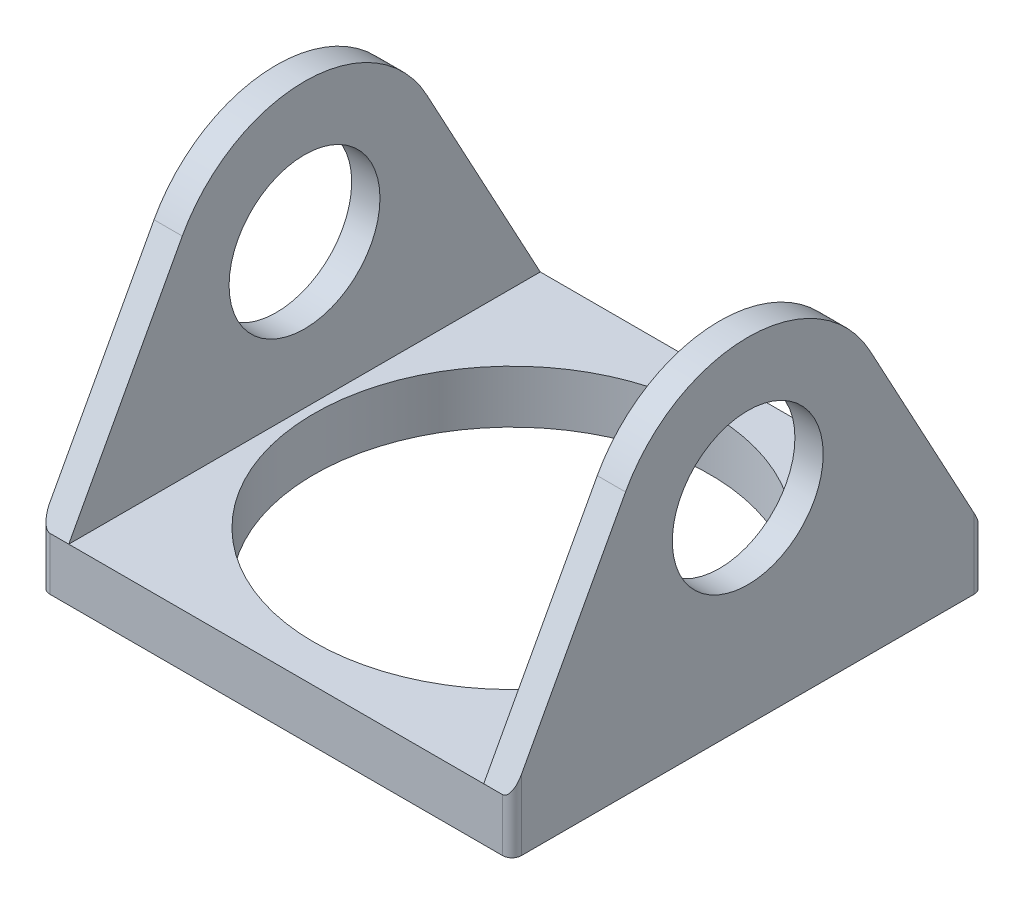
ISO-10303-21;
HEADER;
FILE_DESCRIPTION(('STEP AP214'),'2;1');
FILE_NAME('part.step','',(''),(''),'','','');
FILE_SCHEMA(('AUTOMOTIVE_DESIGN { 1 0 10303 214 1 1 1 1 }'));
ENDSEC;
DATA;
#1=APPLICATION_CONTEXT('core data for automotive mechanical design processes');
#2=APPLICATION_PROTOCOL_DEFINITION('international standard','automotive_design',2000,#1);
#3=PRODUCT_CONTEXT('',#1,'mechanical');
#4=PRODUCT('Part','Part','',(#3));
#5=PRODUCT_RELATED_PRODUCT_CATEGORY('part','',(#4));
#6=PRODUCT_DEFINITION_FORMATION('','',#4);
#7=PRODUCT_DEFINITION_CONTEXT('part definition',#1,'design');
#8=PRODUCT_DEFINITION('design','',#6,#7);
#9=PRODUCT_DEFINITION_SHAPE('','',#8);
#10=(LENGTH_UNIT() NAMED_UNIT(*) SI_UNIT(.MILLI.,.METRE.));
#11=(NAMED_UNIT(*) PLANE_ANGLE_UNIT() SI_UNIT($,.RADIAN.));
#12=(NAMED_UNIT(*) SI_UNIT($,.STERADIAN.) SOLID_ANGLE_UNIT());
#13=UNCERTAINTY_MEASURE_WITH_UNIT(LENGTH_MEASURE(1.E-05),#10,'distance_accuracy_value','');
#14=(GEOMETRIC_REPRESENTATION_CONTEXT(3) GLOBAL_UNCERTAINTY_ASSIGNED_CONTEXT((#13)) GLOBAL_UNIT_ASSIGNED_CONTEXT((#10,
#11,#12)) REPRESENTATION_CONTEXT('',''));
#15=CARTESIAN_POINT('',(0.,0.,0.));
#16=DIRECTION('',(0.,0.,1.));
#17=DIRECTION('',(1.,0.,0.));
#18=AXIS2_PLACEMENT_3D('',#15,#16,#17);
#19=CARTESIAN_POINT('',(125.,28.,-125.));
#20=DIRECTION('',(-1.,0.,0.));
#21=DIRECTION('',(0.,0.,1.));
#22=AXIS2_PLACEMENT_3D('',#19,#20,#21);
#23=PLANE('',#22);
#24=CARTESIAN_POINT('',(125.,104.34,0.));
#25=DIRECTION('',(1.,0.,0.));
#26=DIRECTION('',(0.,0.,-1.));
#27=AXIS2_PLACEMENT_3D('',#24,#25,#26);
#28=CIRCLE('',#27,40.);
#29=CARTESIAN_POINT('',(125.,104.34,-40.));
#30=VERTEX_POINT('',#29);
#31=EDGE_CURVE('E205',#30,#30,#28,.T.);
#32=ORIENTED_EDGE('',*,*,#31,.F.);
#33=EDGE_LOOP('',(#32));
#34=FACE_BOUND('',#33,.T.);
#35=DIRECTION('',(0.,-0.879697709797917,0.475533320994755));
#36=VECTOR('',#35,1.);
#37=CARTESIAN_POINT('',(125.,132.581393352921,68.4670151559249));
#38=LINE('',#37,#36);
#39=CARTESIAN_POINT('',(125.,139.367784424474,64.7985333037145));
#40=VERTEX_POINT('',#39);
#41=CARTESIAN_POINT('',(125.,37.2495906276104,120.));
#42=VERTEX_POINT('',#41);
#43=EDGE_CURVE('E201',#40,#42,#38,.T.);
#44=ORIENTED_EDGE('',*,*,#43,.T.);
#45=DIRECTION('',(0.,-1.,0.));
#46=VECTOR('',#45,1.);
#47=CARTESIAN_POINT('',(125.,28.,120.));
#48=LINE('',#47,#46);
#49=CARTESIAN_POINT('',(125.,0.,120.));
#50=VERTEX_POINT('',#49);
#51=EDGE_CURVE('E299',#42,#50,#48,.T.);
#52=ORIENTED_EDGE('',*,*,#51,.T.);
#53=DIRECTION('',(0.,0.,-1.));
#54=VECTOR('',#53,1.);
#55=CARTESIAN_POINT('',(125.,0.,-125.));
#56=LINE('',#55,#54);
#57=CARTESIAN_POINT('',(125.,0.,-120.));
#58=VERTEX_POINT('',#57);
#59=EDGE_CURVE('E233',#50,#58,#56,.T.);
#60=ORIENTED_EDGE('',*,*,#59,.T.);
#61=DIRECTION('',(0.,-1.,0.));
#62=VECTOR('',#61,1.);
#63=CARTESIAN_POINT('',(125.,28.,-120.));
#64=LINE('',#63,#62);
#65=CARTESIAN_POINT('',(125.,37.2495906276107,-120.));
#66=VERTEX_POINT('',#65);
#67=EDGE_CURVE('E296',#58,#66,#64,.F.);
#68=ORIENTED_EDGE('',*,*,#67,.T.);
#69=DIRECTION('',(0.,0.879697709797917,0.475533320994755));
#70=VECTOR('',#69,1.);
#71=CARTESIAN_POINT('',(125.,28.,-125.));
#72=LINE('',#71,#70);
#73=CARTESIAN_POINT('',(125.,139.367784424474,-64.7985333037146));
#74=VERTEX_POINT('',#73);
#75=EDGE_CURVE('E165',#66,#74,#72,.T.);
#76=ORIENTED_EDGE('',*,*,#75,.T.);
#77=CARTESIAN_POINT('',(125.,104.34,0.));
#78=DIRECTION('',(-1.,0.,0.));
#79=DIRECTION('',(0.,0.,1.));
#80=AXIS2_PLACEMENT_3D('',#77,#78,#79);
#81=CIRCLE('',#80,73.66);
#82=EDGE_CURVE('E186',#74,#40,#81,.F.);
#83=ORIENTED_EDGE('',*,*,#82,.T.);
#84=EDGE_LOOP('',(#44,#52,#60,#68,#76,#83));
#85=FACE_BOUND('',#84,.T.);
#86=ADVANCED_FACE('F38',(#34,#85),#23,.F.);
#87=CARTESIAN_POINT('',(-125.,28.,-125.));
#88=DIRECTION('',(0.,0.,1.));
#89=DIRECTION('',(1.,0.,0.));
#90=AXIS2_PLACEMENT_3D('',#87,#88,#89);
#91=PLANE('',#90);
#92=DIRECTION('',(-1.,0.,0.));
#93=VECTOR('',#92,1.);
#94=CARTESIAN_POINT('',(-125.,0.,-125.));
#95=LINE('',#94,#93);
#96=CARTESIAN_POINT('',(120.,0.,-125.));
#97=VERTEX_POINT('',#96);
#98=CARTESIAN_POINT('',(-120.,0.,-125.));
#99=VERTEX_POINT('',#98);
#100=EDGE_CURVE('E247',#97,#99,#95,.T.);
#101=ORIENTED_EDGE('',*,*,#100,.T.);
#102=DIRECTION('',(0.,-1.,0.));
#103=VECTOR('',#102,1.);
#104=CARTESIAN_POINT('',(-120.,28.,-125.));
#105=LINE('',#104,#103);
#106=CARTESIAN_POINT('',(-120.,28.,-125.));
#107=VERTEX_POINT('',#106);
#108=EDGE_CURVE('E60',#99,#107,#105,.F.);
#109=ORIENTED_EDGE('',*,*,#108,.T.);
#110=DIRECTION('',(-1.,0.,0.));
#111=VECTOR('',#110,1.);
#112=CARTESIAN_POINT('',(619.791622807016,28.,-125.));
#113=LINE('',#112,#111);
#114=CARTESIAN_POINT('',(-110.,28.,-125.));
#115=VERTEX_POINT('',#114);
#116=EDGE_CURVE('E316',#115,#107,#113,.T.);
#117=ORIENTED_EDGE('',*,*,#116,.F.);
#118=DIRECTION('',(-1.,0.,0.));
#119=VECTOR('',#118,1.);
#120=CARTESIAN_POINT('',(-125.,28.,-125.));
#121=LINE('',#120,#119);
#122=CARTESIAN_POINT('',(110.,28.,-125.));
#123=VERTEX_POINT('',#122);
#124=EDGE_CURVE('E234',#123,#115,#121,.T.);
#125=ORIENTED_EDGE('',*,*,#124,.F.);
#126=CARTESIAN_POINT('',(120.,28.,-125.));
#127=VERTEX_POINT('',#126);
#128=EDGE_CURVE('E330',#127,#123,#113,.T.);
#129=ORIENTED_EDGE('',*,*,#128,.F.);
#130=DIRECTION('',(0.,-1.,0.));
#131=VECTOR('',#130,1.);
#132=CARTESIAN_POINT('',(120.,28.,-125.));
#133=LINE('',#132,#131);
#134=EDGE_CURVE('E306',#127,#97,#133,.T.);
#135=ORIENTED_EDGE('',*,*,#134,.T.);
#136=EDGE_LOOP('',(#101,#109,#117,#125,#129,#135));
#137=FACE_BOUND('',#136,.T.);
#138=ADVANCED_FACE('F327',(#137),#91,.F.);
#139=CARTESIAN_POINT('',(-125.,28.,-125.));
#140=DIRECTION('',(1.,0.,0.));
#141=DIRECTION('',(0.,0.,-1.));
#142=AXIS2_PLACEMENT_3D('',#139,#140,#141);
#143=PLANE('',#142);
#144=CARTESIAN_POINT('',(-125.,104.34,0.));
#145=DIRECTION('',(1.,0.,0.));
#146=DIRECTION('',(0.,0.,-1.));
#147=AXIS2_PLACEMENT_3D('',#144,#145,#146);
#148=CIRCLE('',#147,40.);
#149=CARTESIAN_POINT('',(-125.,104.34,-40.));
#150=VERTEX_POINT('',#149);
#151=EDGE_CURVE('E206',#150,#150,#148,.T.);
#152=ORIENTED_EDGE('',*,*,#151,.T.);
#153=EDGE_LOOP('',(#152));
#154=FACE_BOUND('',#153,.T.);
#155=DIRECTION('',(0.,0.,1.));
#156=VECTOR('',#155,1.);
#157=CARTESIAN_POINT('',(-125.,0.,-125.));
#158=LINE('',#157,#156);
#159=CARTESIAN_POINT('',(-125.,0.,-120.));
#160=VERTEX_POINT('',#159);
#161=CARTESIAN_POINT('',(-125.,0.,120.));
#162=VERTEX_POINT('',#161);
#163=EDGE_CURVE('E250',#160,#162,#158,.T.);
#164=ORIENTED_EDGE('',*,*,#163,.T.);
#165=DIRECTION('',(0.,-1.,0.));
#166=VECTOR('',#165,1.);
#167=CARTESIAN_POINT('',(-125.,28.,120.));
#168=LINE('',#167,#166);
#169=CARTESIAN_POINT('',(-125.,37.2495906276105,120.));
#170=VERTEX_POINT('',#169);
#171=EDGE_CURVE('E290',#162,#170,#168,.F.);
#172=ORIENTED_EDGE('',*,*,#171,.T.);
#173=DIRECTION('',(0.,0.879697709797917,-0.475533320994755));
#174=VECTOR('',#173,1.);
#175=CARTESIAN_POINT('',(-125.,132.581393352921,68.467015155925));
#176=LINE('',#175,#174);
#177=CARTESIAN_POINT('',(-125.,139.367784424474,64.7985333037146));
#178=VERTEX_POINT('',#177);
#179=EDGE_CURVE('E164',#170,#178,#176,.T.);
#180=ORIENTED_EDGE('',*,*,#179,.T.);
#181=CARTESIAN_POINT('',(-125.,104.34,0.));
#182=DIRECTION('',(1.,0.,0.));
#183=DIRECTION('',(0.,0.,-1.));
#184=AXIS2_PLACEMENT_3D('',#181,#182,#183);
#185=CIRCLE('',#184,73.66);
#186=CARTESIAN_POINT('',(-125.,139.367784424474,-64.7985333037145));
#187=VERTEX_POINT('',#186);
#188=EDGE_CURVE('E153',#178,#187,#185,.F.);
#189=ORIENTED_EDGE('',*,*,#188,.T.);
#190=DIRECTION('',(0.,-0.879697709797917,-0.475533320994755));
#191=VECTOR('',#190,1.);
#192=CARTESIAN_POINT('',(-125.,28.,-125.));
#193=LINE('',#192,#191);
#194=CARTESIAN_POINT('',(-125.,37.2495906276105,-120.));
#195=VERTEX_POINT('',#194);
#196=EDGE_CURVE('E193',#187,#195,#193,.T.);
#197=ORIENTED_EDGE('',*,*,#196,.T.);
#198=DIRECTION('',(0.,-1.,0.));
#199=VECTOR('',#198,1.);
#200=CARTESIAN_POINT('',(-125.,28.,-120.));
#201=LINE('',#200,#199);
#202=EDGE_CURVE('E286',#195,#160,#201,.T.);
#203=ORIENTED_EDGE('',*,*,#202,.T.);
#204=EDGE_LOOP('',(#164,#172,#180,#189,#197,#203));
#205=FACE_BOUND('',#204,.T.);
#206=ADVANCED_FACE('F320',(#154,#205),#143,.F.);
#207=CARTESIAN_POINT('',(-125.,28.,125.));
#208=DIRECTION('',(0.,0.,-1.));
#209=DIRECTION('',(-1.,0.,0.));
#210=AXIS2_PLACEMENT_3D('',#207,#208,#209);
#211=PLANE('',#210);
#212=DIRECTION('',(-1.,0.,0.));
#213=VECTOR('',#212,1.);
#214=CARTESIAN_POINT('',(619.791622807016,28.,125.));
#215=LINE('',#214,#213);
#216=CARTESIAN_POINT('',(-110.,28.,125.));
#217=VERTEX_POINT('',#216);
#218=CARTESIAN_POINT('',(-120.,28.,125.));
#219=VERTEX_POINT('',#218);
#220=EDGE_CURVE('E162',#217,#219,#215,.T.);
#221=ORIENTED_EDGE('',*,*,#220,.T.);
#222=DIRECTION('',(0.,-1.,0.));
#223=VECTOR('',#222,1.);
#224=CARTESIAN_POINT('',(-120.,28.,125.));
#225=LINE('',#224,#223);
#226=CARTESIAN_POINT('',(-120.,0.,125.));
#227=VERTEX_POINT('',#226);
#228=EDGE_CURVE('E270',#219,#227,#225,.T.);
#229=ORIENTED_EDGE('',*,*,#228,.T.);
#230=DIRECTION('',(1.,0.,0.));
#231=VECTOR('',#230,1.);
#232=CARTESIAN_POINT('',(-125.,0.,125.));
#233=LINE('',#232,#231);
#234=CARTESIAN_POINT('',(120.,0.,125.));
#235=VERTEX_POINT('',#234);
#236=EDGE_CURVE('E239',#227,#235,#233,.T.);
#237=ORIENTED_EDGE('',*,*,#236,.T.);
#238=DIRECTION('',(0.,-1.,0.));
#239=VECTOR('',#238,1.);
#240=CARTESIAN_POINT('',(120.,28.,125.));
#241=LINE('',#240,#239);
#242=CARTESIAN_POINT('',(120.,28.,125.));
#243=VERTEX_POINT('',#242);
#244=EDGE_CURVE('E267',#235,#243,#241,.F.);
#245=ORIENTED_EDGE('',*,*,#244,.T.);
#246=CARTESIAN_POINT('',(110.,28.,125.));
#247=VERTEX_POINT('',#246);
#248=EDGE_CURVE('E183',#243,#247,#215,.T.);
#249=ORIENTED_EDGE('',*,*,#248,.T.);
#250=DIRECTION('',(1.,0.,0.));
#251=VECTOR('',#250,1.);
#252=CARTESIAN_POINT('',(-125.,28.,125.));
#253=LINE('',#252,#251);
#254=EDGE_CURVE('E238',#217,#247,#253,.T.);
#255=ORIENTED_EDGE('',*,*,#254,.F.);
#256=EDGE_LOOP('',(#221,#229,#237,#245,#249,#255));
#257=FACE_BOUND('',#256,.T.);
#258=ADVANCED_FACE('F342',(#257),#211,.F.);
#259=CARTESIAN_POINT('',(0.,28.,0.));
#260=DIRECTION('',(0.,1.,0.));
#261=DIRECTION('',(0.,0.,1.));
#262=AXIS2_PLACEMENT_3D('',#259,#260,#261);
#263=PLANE('',#262);
#264=DIRECTION('',(0.,0.,-1.));
#265=VECTOR('',#264,1.);
#266=CARTESIAN_POINT('',(110.,28.,-125.));
#267=LINE('',#266,#265);
#268=EDGE_CURVE('E218',#247,#123,#267,.T.);
#269=ORIENTED_EDGE('',*,*,#268,.T.);
#270=ORIENTED_EDGE('',*,*,#124,.T.);
#271=DIRECTION('',(0.,0.,-1.));
#272=VECTOR('',#271,1.);
#273=CARTESIAN_POINT('',(-110.,28.,-125.));
#274=LINE('',#273,#272);
#275=EDGE_CURVE('E222',#217,#115,#274,.T.);
#276=ORIENTED_EDGE('',*,*,#275,.F.);
#277=ORIENTED_EDGE('',*,*,#254,.T.);
#278=EDGE_LOOP('',(#269,#270,#276,#277));
#279=FACE_BOUND('',#278,.T.);
#280=CARTESIAN_POINT('',(0.,28.,0.));
#281=DIRECTION('',(0.,1.,0.));
#282=DIRECTION('',(0.,0.,1.));
#283=AXIS2_PLACEMENT_3D('',#280,#281,#282);
#284=CIRCLE('',#283,105.);
#285=CARTESIAN_POINT('',(0.,28.,105.));
#286=VERTEX_POINT('',#285);
#287=EDGE_CURVE('E225',#286,#286,#284,.T.);
#288=ORIENTED_EDGE('',*,*,#287,.F.);
#289=EDGE_LOOP('',(#288));
#290=FACE_BOUND('',#289,.T.);
#291=ADVANCED_FACE('F374',(#279,#290),#263,.T.);
#292=CARTESIAN_POINT('',(0.,0.,0.));
#293=DIRECTION('',(0.,1.,0.));
#294=DIRECTION('',(0.,0.,1.));
#295=AXIS2_PLACEMENT_3D('',#292,#293,#294);
#296=PLANE('',#295);
#297=CARTESIAN_POINT('',(0.,0.,0.));
#298=DIRECTION('',(0.,1.,0.));
#299=DIRECTION('',(0.,0.,1.));
#300=AXIS2_PLACEMENT_3D('',#297,#298,#299);
#301=CIRCLE('',#300,105.);
#302=CARTESIAN_POINT('',(0.,0.,105.));
#303=VERTEX_POINT('',#302);
#304=EDGE_CURVE('E229',#303,#303,#301,.F.);
#305=ORIENTED_EDGE('',*,*,#304,.F.);
#306=EDGE_LOOP('',(#305));
#307=FACE_BOUND('',#306,.T.);
#308=ORIENTED_EDGE('',*,*,#236,.F.);
#309=CARTESIAN_POINT('',(-120.,0.,120.));
#310=DIRECTION('',(0.,1.,0.));
#311=DIRECTION('',(0.,0.,1.));
#312=AXIS2_PLACEMENT_3D('',#309,#310,#311);
#313=CIRCLE('',#312,5.);
#314=EDGE_CURVE('E283',#227,#162,#313,.F.);
#315=ORIENTED_EDGE('',*,*,#314,.T.);
#316=ORIENTED_EDGE('',*,*,#163,.F.);
#317=CARTESIAN_POINT('',(-120.,0.,-120.));
#318=DIRECTION('',(0.,1.,0.));
#319=DIRECTION('',(0.,0.,1.));
#320=AXIS2_PLACEMENT_3D('',#317,#318,#319);
#321=CIRCLE('',#320,5.);
#322=EDGE_CURVE('E277',#160,#99,#321,.F.);
#323=ORIENTED_EDGE('',*,*,#322,.T.);
#324=ORIENTED_EDGE('',*,*,#100,.F.);
#325=CARTESIAN_POINT('',(120.,0.,-120.));
#326=DIRECTION('',(0.,1.,0.));
#327=DIRECTION('',(0.,0.,1.));
#328=AXIS2_PLACEMENT_3D('',#325,#326,#327);
#329=CIRCLE('',#328,5.);
#330=EDGE_CURVE('E274',#97,#58,#329,.F.);
#331=ORIENTED_EDGE('',*,*,#330,.T.);
#332=ORIENTED_EDGE('',*,*,#59,.F.);
#333=CARTESIAN_POINT('',(120.,0.,120.));
#334=DIRECTION('',(0.,1.,0.));
#335=DIRECTION('',(0.,0.,1.));
#336=AXIS2_PLACEMENT_3D('',#333,#334,#335);
#337=CIRCLE('',#336,5.);
#338=EDGE_CURVE('E280',#50,#235,#337,.F.);
#339=ORIENTED_EDGE('',*,*,#338,.T.);
#340=EDGE_LOOP('',(#308,#315,#316,#323,#324,#331,#332,#339));
#341=FACE_BOUND('',#340,.T.);
#342=ADVANCED_FACE('F326',(#307,#341),#296,.F.);
#343=CARTESIAN_POINT('',(0.,-0.001000000000001,0.));
#344=DIRECTION('',(0.,1.,0.));
#345=DIRECTION('',(0.,0.,1.));
#346=AXIS2_PLACEMENT_3D('',#343,#344,#345);
#347=CYLINDRICAL_SURFACE('',#346,105.);
#348=ORIENTED_EDGE('',*,*,#287,.T.);
#349=EDGE_LOOP('',(#348));
#350=FACE_BOUND('',#349,.T.);
#351=ORIENTED_EDGE('',*,*,#304,.T.);
#352=EDGE_LOOP('',(#351));
#353=FACE_BOUND('',#352,.T.);
#354=ADVANCED_FACE('F377',(#350,#353),#347,.F.);
#355=CARTESIAN_POINT('',(-110.,178.,-125.));
#356=DIRECTION('',(-1.,0.,0.));
#357=DIRECTION('',(0.,0.,1.));
#358=AXIS2_PLACEMENT_3D('',#355,#356,#357);
#359=PLANE('',#358);
#360=CARTESIAN_POINT('',(-110.,104.34,0.));
#361=DIRECTION('',(-1.,0.,0.));
#362=DIRECTION('',(0.,0.,1.));
#363=AXIS2_PLACEMENT_3D('',#360,#361,#362);
#364=CIRCLE('',#363,40.);
#365=CARTESIAN_POINT('',(-110.,104.34,40.0000000000001));
#366=VERTEX_POINT('',#365);
#367=EDGE_CURVE('E214',#366,#366,#364,.T.);
#368=ORIENTED_EDGE('',*,*,#367,.T.);
#369=EDGE_LOOP('',(#368));
#370=FACE_BOUND('',#369,.T.);
#371=CARTESIAN_POINT('',(-110.,104.34,0.));
#372=DIRECTION('',(-1.,0.,0.));
#373=DIRECTION('',(0.,0.,1.));
#374=AXIS2_PLACEMENT_3D('',#371,#372,#373);
#375=CIRCLE('',#374,73.66);
#376=CARTESIAN_POINT('',(-110.,139.367784424474,-64.7985333037145));
#377=VERTEX_POINT('',#376);
#378=CARTESIAN_POINT('',(-110.,139.367784424474,64.7985333037146));
#379=VERTEX_POINT('',#378);
#380=EDGE_CURVE('E142',#377,#379,#375,.F.);
#381=ORIENTED_EDGE('',*,*,#380,.T.);
#382=DIRECTION('',(0.,-0.879697709797917,0.475533320994755));
#383=VECTOR('',#382,1.);
#384=CARTESIAN_POINT('',(-110.,248.661602446476,5.71817914417244));
#385=LINE('',#384,#383);
#386=EDGE_CURVE('E146',#379,#217,#385,.T.);
#387=ORIENTED_EDGE('',*,*,#386,.T.);
#388=ORIENTED_EDGE('',*,*,#275,.T.);
#389=DIRECTION('',(0.,0.879697709797917,0.475533320994755));
#390=VECTOR('',#389,1.);
#391=CARTESIAN_POINT('',(-110.,144.080209093555,-62.2511639882475));
#392=LINE('',#391,#390);
#393=EDGE_CURVE('E148',#115,#377,#392,.T.);
#394=ORIENTED_EDGE('',*,*,#393,.T.);
#395=EDGE_LOOP('',(#381,#387,#388,#394));
#396=FACE_BOUND('',#395,.T.);
#397=ADVANCED_FACE('F144',(#370,#396),#359,.F.);
#398=CARTESIAN_POINT('',(110.,178.,-125.));
#399=DIRECTION('',(-1.,0.,0.));
#400=DIRECTION('',(0.,0.,1.));
#401=AXIS2_PLACEMENT_3D('',#398,#399,#400);
#402=PLANE('',#401);
#403=DIRECTION('',(0.,-0.879697709797917,0.475533320994755));
#404=VECTOR('',#403,1.);
#405=CARTESIAN_POINT('',(110.,248.661602446476,5.71817914417239));
#406=LINE('',#405,#404);
#407=CARTESIAN_POINT('',(110.,139.367784424474,64.7985333037145));
#408=VERTEX_POINT('',#407);
#409=EDGE_CURVE('E263',#408,#247,#406,.T.);
#410=ORIENTED_EDGE('',*,*,#409,.F.);
#411=CARTESIAN_POINT('',(110.,104.34,0.));
#412=DIRECTION('',(-1.,0.,0.));
#413=DIRECTION('',(0.,0.,1.));
#414=AXIS2_PLACEMENT_3D('',#411,#412,#413);
#415=CIRCLE('',#414,73.66);
#416=CARTESIAN_POINT('',(110.,139.367784424474,-64.7985333037145));
#417=VERTEX_POINT('',#416);
#418=EDGE_CURVE('E154',#417,#408,#415,.F.);
#419=ORIENTED_EDGE('',*,*,#418,.F.);
#420=DIRECTION('',(0.,0.879697709797917,0.475533320994755));
#421=VECTOR('',#420,1.);
#422=CARTESIAN_POINT('',(110.,144.080209093555,-62.2511639882476));
#423=LINE('',#422,#421);
#424=EDGE_CURVE('E243',#123,#417,#423,.T.);
#425=ORIENTED_EDGE('',*,*,#424,.F.);
#426=ORIENTED_EDGE('',*,*,#268,.F.);
#427=EDGE_LOOP('',(#410,#419,#425,#426));
#428=FACE_BOUND('',#427,.T.);
#429=CARTESIAN_POINT('',(110.,104.34,0.));
#430=DIRECTION('',(-1.,0.,0.));
#431=DIRECTION('',(0.,0.,1.));
#432=AXIS2_PLACEMENT_3D('',#429,#430,#431);
#433=CIRCLE('',#432,40.);
#434=CARTESIAN_POINT('',(110.,104.34,40.));
#435=VERTEX_POINT('',#434);
#436=EDGE_CURVE('E210',#435,#435,#433,.T.);
#437=ORIENTED_EDGE('',*,*,#436,.F.);
#438=EDGE_LOOP('',(#437));
#439=FACE_BOUND('',#438,.T.);
#440=ADVANCED_FACE('F387',(#428,#439),#402,.T.);
#441=CARTESIAN_POINT('',(-125.,104.34,0.));
#442=DIRECTION('',(1.,0.,0.));
#443=DIRECTION('',(0.,0.,-1.));
#444=AXIS2_PLACEMENT_3D('',#441,#442,#443);
#445=CYLINDRICAL_SURFACE('',#444,40.);
#446=ORIENTED_EDGE('',*,*,#436,.T.);
#447=EDGE_LOOP('',(#446));
#448=FACE_BOUND('',#447,.T.);
#449=ORIENTED_EDGE('',*,*,#31,.T.);
#450=EDGE_LOOP('',(#449));
#451=FACE_BOUND('',#450,.T.);
#452=ADVANCED_FACE('F391',(#448,#451),#445,.F.);
#453=ORIENTED_EDGE('',*,*,#151,.F.);
#454=EDGE_LOOP('',(#453));
#455=FACE_BOUND('',#454,.T.);
#456=ORIENTED_EDGE('',*,*,#367,.F.);
#457=EDGE_LOOP('',(#456));
#458=FACE_BOUND('',#457,.T.);
#459=ADVANCED_FACE('F395',(#455,#458),#445,.F.);
#460=CARTESIAN_POINT('',(619.791622807016,28.,-125.));
#461=DIRECTION('',(0.,-0.475533320994755,0.879697709797917));
#462=DIRECTION('',(0.,-0.879697709797917,-0.475533320994755));
#463=AXIS2_PLACEMENT_3D('',#460,#461,#462);
#464=PLANE('',#463);
#465=ORIENTED_EDGE('',*,*,#75,.F.);
#466=CARTESIAN_POINT('',(120.,37.2495906276106,-120.));
#467=DIRECTION('',(0.,-0.475533320994755,0.879697709797917));
#468=DIRECTION('',(0.,-0.879697709797917,-0.475533320994755));
#469=AXIS2_PLACEMENT_3D('',#466,#467,#468);
#470=ELLIPSE('',#469,10.514510296651,5.);
#471=EDGE_CURVE('E11',#66,#127,#470,.F.);
#472=ORIENTED_EDGE('',*,*,#471,.T.);
#473=ORIENTED_EDGE('',*,*,#128,.T.);
#474=ORIENTED_EDGE('',*,*,#424,.T.);
#475=DIRECTION('',(-1.,0.,0.));
#476=VECTOR('',#475,1.);
#477=CARTESIAN_POINT('',(619.791622807016,139.367784424474,-64.7985333037147));
#478=LINE('',#477,#476);
#479=EDGE_CURVE('E171',#74,#417,#478,.T.);
#480=ORIENTED_EDGE('',*,*,#479,.F.);
#481=EDGE_LOOP('',(#465,#472,#473,#474,#480));
#482=FACE_BOUND('',#481,.T.);
#483=ADVANCED_FACE('F402',(#482),#464,.F.);
#484=CARTESIAN_POINT('',(619.791622807016,104.34,-1.21130201944833E-13));
#485=DIRECTION('',(-1.,0.,0.));
#486=DIRECTION('',(0.,0.,1.));
#487=AXIS2_PLACEMENT_3D('',#484,#485,#486);
#488=CYLINDRICAL_SURFACE('',#487,73.66);
#489=ORIENTED_EDGE('',*,*,#82,.F.);
#490=ORIENTED_EDGE('',*,*,#479,.T.);
#491=ORIENTED_EDGE('',*,*,#418,.T.);
#492=DIRECTION('',(-1.,0.,0.));
#493=VECTOR('',#492,1.);
#494=CARTESIAN_POINT('',(619.791622807016,139.367784424474,64.7985333037144));
#495=LINE('',#494,#493);
#496=EDGE_CURVE('E170',#40,#408,#495,.T.);
#497=ORIENTED_EDGE('',*,*,#496,.F.);
#498=EDGE_LOOP('',(#489,#490,#491,#497));
#499=FACE_BOUND('',#498,.T.);
#500=ADVANCED_FACE('F358',(#499),#488,.T.);
#501=CARTESIAN_POINT('',(619.791622807016,28.,125.));
#502=DIRECTION('',(0.,-0.475533320994755,-0.879697709797917));
#503=DIRECTION('',(0.,0.879697709797917,-0.475533320994755));
#504=AXIS2_PLACEMENT_3D('',#501,#502,#503);
#505=PLANE('',#504);
#506=ORIENTED_EDGE('',*,*,#248,.F.);
#507=CARTESIAN_POINT('',(120.,37.2495906276104,120.));
#508=DIRECTION('',(0.,-0.475533320994755,-0.879697709797917));
#509=DIRECTION('',(0.,-0.879697709797917,0.475533320994755));
#510=AXIS2_PLACEMENT_3D('',#507,#508,#509);
#511=ELLIPSE('',#510,10.514510296651,5.);
#512=EDGE_CURVE('E303',#243,#42,#511,.F.);
#513=ORIENTED_EDGE('',*,*,#512,.T.);
#514=ORIENTED_EDGE('',*,*,#43,.F.);
#515=ORIENTED_EDGE('',*,*,#496,.T.);
#516=ORIENTED_EDGE('',*,*,#409,.T.);
#517=EDGE_LOOP('',(#506,#513,#514,#515,#516));
#518=FACE_BOUND('',#517,.T.);
#519=ADVANCED_FACE('F397',(#518),#505,.F.);
#520=ORIENTED_EDGE('',*,*,#179,.F.);
#521=CARTESIAN_POINT('',(-120.,37.2495906276105,120.));
#522=DIRECTION('',(0.,-0.475533320994755,-0.879697709797917));
#523=DIRECTION('',(0.,-0.879697709797917,0.475533320994755));
#524=AXIS2_PLACEMENT_3D('',#521,#522,#523);
#525=ELLIPSE('',#524,10.514510296651,5.);
#526=EDGE_CURVE('E293',#170,#219,#525,.F.);
#527=ORIENTED_EDGE('',*,*,#526,.T.);
#528=ORIENTED_EDGE('',*,*,#220,.F.);
#529=ORIENTED_EDGE('',*,*,#386,.F.);
#530=EDGE_CURVE('E160',#379,#178,#495,.T.);
#531=ORIENTED_EDGE('',*,*,#530,.T.);
#532=EDGE_LOOP('',(#520,#527,#528,#529,#531));
#533=FACE_BOUND('',#532,.T.);
#534=ADVANCED_FACE('F159',(#533),#505,.F.);
#535=ORIENTED_EDGE('',*,*,#116,.T.);
#536=CARTESIAN_POINT('',(-120.,37.2495906276105,-120.));
#537=DIRECTION('',(0.,-0.475533320994755,0.879697709797917));
#538=DIRECTION('',(0.,-0.879697709797917,-0.475533320994755));
#539=AXIS2_PLACEMENT_3D('',#536,#537,#538);
#540=ELLIPSE('',#539,10.514510296651,5.);
#541=EDGE_CURVE('E47',#107,#195,#540,.F.);
#542=ORIENTED_EDGE('',*,*,#541,.T.);
#543=ORIENTED_EDGE('',*,*,#196,.F.);
#544=EDGE_CURVE('E177',#377,#187,#478,.T.);
#545=ORIENTED_EDGE('',*,*,#544,.F.);
#546=ORIENTED_EDGE('',*,*,#393,.F.);
#547=EDGE_LOOP('',(#535,#542,#543,#545,#546));
#548=FACE_BOUND('',#547,.T.);
#549=ADVANCED_FACE('F315',(#548),#464,.F.);
#550=ORIENTED_EDGE('',*,*,#188,.F.);
#551=ORIENTED_EDGE('',*,*,#530,.F.);
#552=ORIENTED_EDGE('',*,*,#380,.F.);
#553=ORIENTED_EDGE('',*,*,#544,.T.);
#554=EDGE_LOOP('',(#550,#551,#552,#553));
#555=FACE_BOUND('',#554,.T.);
#556=ADVANCED_FACE('F168',(#555),#488,.T.);
#557=CARTESIAN_POINT('',(-120.,28.,120.));
#558=DIRECTION('',(0.,-1.,0.));
#559=DIRECTION('',(0.,0.,-1.));
#560=AXIS2_PLACEMENT_3D('',#557,#558,#559);
#561=CYLINDRICAL_SURFACE('',#560,5.);
#562=ORIENTED_EDGE('',*,*,#526,.F.);
#563=ORIENTED_EDGE('',*,*,#171,.F.);
#564=ORIENTED_EDGE('',*,*,#314,.F.);
#565=ORIENTED_EDGE('',*,*,#228,.F.);
#566=EDGE_LOOP('',(#562,#563,#564,#565));
#567=FACE_BOUND('',#566,.T.);
#568=ADVANCED_FACE('F348',(#567),#561,.T.);
#569=CARTESIAN_POINT('',(120.,28.,120.));
#570=DIRECTION('',(0.,-1.,0.));
#571=DIRECTION('',(0.,0.,-1.));
#572=AXIS2_PLACEMENT_3D('',#569,#570,#571);
#573=CYLINDRICAL_SURFACE('',#572,5.);
#574=ORIENTED_EDGE('',*,*,#512,.F.);
#575=ORIENTED_EDGE('',*,*,#244,.F.);
#576=ORIENTED_EDGE('',*,*,#338,.F.);
#577=ORIENTED_EDGE('',*,*,#51,.F.);
#578=EDGE_LOOP('',(#574,#575,#576,#577));
#579=FACE_BOUND('',#578,.T.);
#580=ADVANCED_FACE('F339',(#579),#573,.T.);
#581=CARTESIAN_POINT('',(-120.,28.,-120.));
#582=DIRECTION('',(0.,-1.,0.));
#583=DIRECTION('',(0.,0.,-1.));
#584=AXIS2_PLACEMENT_3D('',#581,#582,#583);
#585=CYLINDRICAL_SURFACE('',#584,5.);
#586=ORIENTED_EDGE('',*,*,#541,.F.);
#587=ORIENTED_EDGE('',*,*,#108,.F.);
#588=ORIENTED_EDGE('',*,*,#322,.F.);
#589=ORIENTED_EDGE('',*,*,#202,.F.);
#590=EDGE_LOOP('',(#586,#587,#588,#589));
#591=FACE_BOUND('',#590,.T.);
#592=ADVANCED_FACE('F322',(#591),#585,.T.);
#593=CARTESIAN_POINT('',(120.,28.,-120.));
#594=DIRECTION('',(0.,-1.,0.));
#595=DIRECTION('',(0.,0.,-1.));
#596=AXIS2_PLACEMENT_3D('',#593,#594,#595);
#597=CYLINDRICAL_SURFACE('',#596,5.);
#598=ORIENTED_EDGE('',*,*,#471,.F.);
#599=ORIENTED_EDGE('',*,*,#67,.F.);
#600=ORIENTED_EDGE('',*,*,#330,.F.);
#601=ORIENTED_EDGE('',*,*,#134,.F.);
#602=EDGE_LOOP('',(#598,#599,#600,#601));
#603=FACE_BOUND('',#602,.T.);
#604=ADVANCED_FACE('F40',(#603),#597,.T.);
#605=CLOSED_SHELL('',(#86,#138,#206,#258,#291,#342,#354,#397,#440,#452,#459,#483,#500,#519,#534,
#549,#556,#568,#580,#592,#604));
#606=MANIFOLD_SOLID_BREP('B2',#605);
#607=ADVANCED_BREP_SHAPE_REPRESENTATION('',(#18,#606),#14);
#608=SHAPE_DEFINITION_REPRESENTATION(#9,#607);
ENDSEC;
END-ISO-10303-21;
